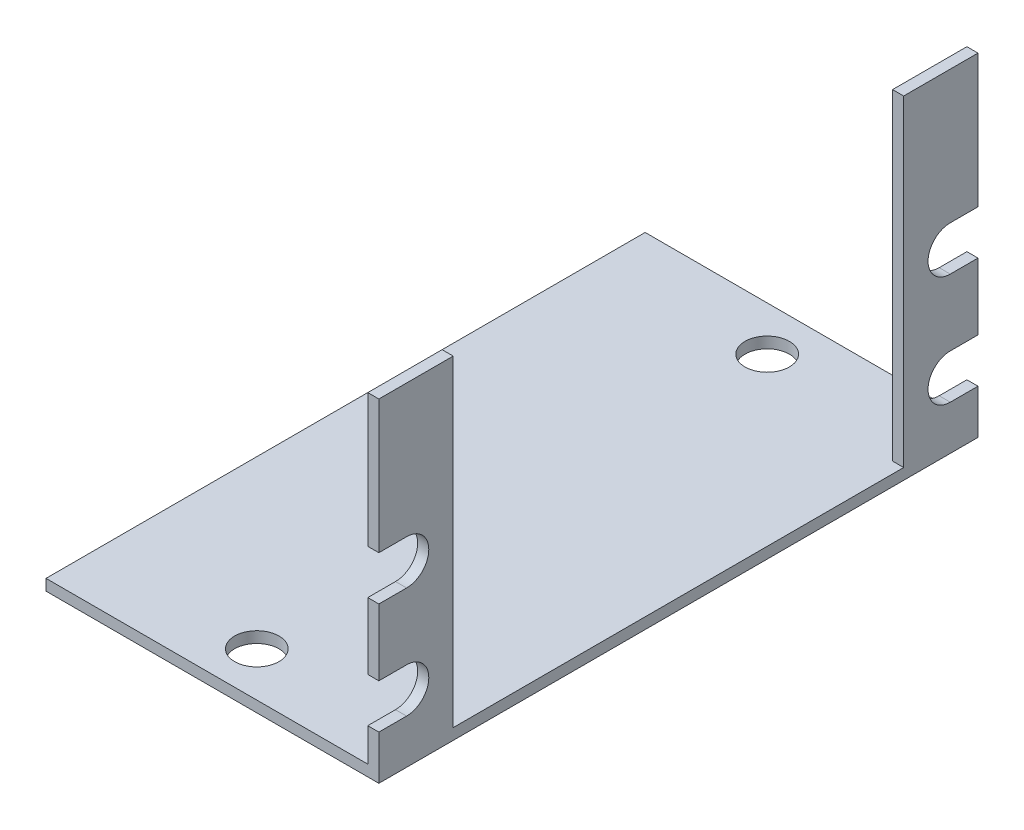
ISO-10303-21;
HEADER;
FILE_DESCRIPTION(('STEP AP214'),'2;1');
FILE_NAME('part.step','',(''),(''),'','','');
FILE_SCHEMA(('AUTOMOTIVE_DESIGN { 1 0 10303 214 1 1 1 1 }'));
ENDSEC;
DATA;
#1=APPLICATION_CONTEXT('core data for automotive mechanical design processes');
#2=APPLICATION_PROTOCOL_DEFINITION('international standard','automotive_design',2000,#1);
#3=PRODUCT_CONTEXT('',#1,'mechanical');
#4=PRODUCT('Part','Part','',(#3));
#5=PRODUCT_RELATED_PRODUCT_CATEGORY('part','',(#4));
#6=PRODUCT_DEFINITION_FORMATION('','',#4);
#7=PRODUCT_DEFINITION_CONTEXT('part definition',#1,'design');
#8=PRODUCT_DEFINITION('design','',#6,#7);
#9=PRODUCT_DEFINITION_SHAPE('','',#8);
#10=(LENGTH_UNIT() NAMED_UNIT(*) SI_UNIT(.MILLI.,.METRE.));
#11=(NAMED_UNIT(*) PLANE_ANGLE_UNIT() SI_UNIT($,.RADIAN.));
#12=(NAMED_UNIT(*) SI_UNIT($,.STERADIAN.) SOLID_ANGLE_UNIT());
#13=UNCERTAINTY_MEASURE_WITH_UNIT(LENGTH_MEASURE(1.E-05),#10,'distance_accuracy_value','');
#14=(GEOMETRIC_REPRESENTATION_CONTEXT(3) GLOBAL_UNCERTAINTY_ASSIGNED_CONTEXT((#13)) GLOBAL_UNIT_ASSIGNED_CONTEXT((#10,
#11,#12)) REPRESENTATION_CONTEXT('',''));
#15=CARTESIAN_POINT('',(0.,0.,0.));
#16=DIRECTION('',(0.,0.,1.));
#17=DIRECTION('',(1.,0.,0.));
#18=AXIS2_PLACEMENT_3D('',#15,#16,#17);
#19=CARTESIAN_POINT('',(-29.,0.,27.));
#20=DIRECTION('',(0.,0.,-1.));
#21=DIRECTION('',(-1.,0.,0.));
#22=AXIS2_PLACEMENT_3D('',#19,#20,#21);
#23=PLANE('',#22);
#24=DIRECTION('',(0.,-1.,0.));
#25=VECTOR('',#24,1.);
#26=CARTESIAN_POINT('',(0.,0.,27.));
#27=LINE('',#26,#25);
#28=CARTESIAN_POINT('',(0.,29.,27.));
#29=VERTEX_POINT('',#28);
#30=CARTESIAN_POINT('',(0.,17.,27.));
#31=VERTEX_POINT('',#30);
#32=EDGE_CURVE('E359',#29,#31,#27,.T.);
#33=ORIENTED_EDGE('',*,*,#32,.T.);
#34=DIRECTION('',(-1.,0.,0.));
#35=VECTOR('',#34,1.);
#36=CARTESIAN_POINT('',(0.999999999999997,17.,27.));
#37=LINE('',#36,#35);
#38=CARTESIAN_POINT('',(0.999999999999997,17.,27.));
#39=VERTEX_POINT('',#38);
#40=EDGE_CURVE('E240',#39,#31,#37,.T.);
#41=ORIENTED_EDGE('',*,*,#40,.F.);
#42=DIRECTION('',(0.,1.,0.));
#43=VECTOR('',#42,1.);
#44=CARTESIAN_POINT('',(0.999999999999994,29.,27.));
#45=LINE('',#44,#43);
#46=CARTESIAN_POINT('',(0.999999999999994,29.,27.));
#47=VERTEX_POINT('',#46);
#48=EDGE_CURVE('E351',#39,#47,#45,.T.);
#49=ORIENTED_EDGE('',*,*,#48,.T.);
#50=DIRECTION('',(-1.,0.,0.));
#51=VECTOR('',#50,1.);
#52=CARTESIAN_POINT('',(0.,29.,27.));
#53=LINE('',#52,#51);
#54=EDGE_CURVE('E355',#47,#29,#53,.T.);
#55=ORIENTED_EDGE('',*,*,#54,.T.);
#56=EDGE_LOOP('',(#33,#41,#49,#55));
#57=FACE_BOUND('',#56,.T.);
#58=ADVANCED_FACE('F32',(#57),#23,.F.);
#59=CARTESIAN_POINT('',(0.999999999999997,7.,27.));
#60=VERTEX_POINT('',#59);
#61=CARTESIAN_POINT('',(0.999999999999997,13.,27.));
#62=VERTEX_POINT('',#61);
#63=EDGE_CURVE('E356',#60,#62,#45,.T.);
#64=ORIENTED_EDGE('',*,*,#63,.T.);
#65=DIRECTION('',(-1.,0.,0.));
#66=VECTOR('',#65,1.);
#67=CARTESIAN_POINT('',(0.999999999999997,13.,27.));
#68=LINE('',#67,#66);
#69=CARTESIAN_POINT('',(0.,13.,27.));
#70=VERTEX_POINT('',#69);
#71=EDGE_CURVE('E211',#62,#70,#68,.T.);
#72=ORIENTED_EDGE('',*,*,#71,.T.);
#73=CARTESIAN_POINT('',(0.,7.,27.));
#74=VERTEX_POINT('',#73);
#75=EDGE_CURVE('E363',#70,#74,#27,.T.);
#76=ORIENTED_EDGE('',*,*,#75,.T.);
#77=DIRECTION('',(-1.,0.,0.));
#78=VECTOR('',#77,1.);
#79=CARTESIAN_POINT('',(0.999999999999997,7.,27.));
#80=LINE('',#79,#78);
#81=EDGE_CURVE('E262',#60,#74,#80,.T.);
#82=ORIENTED_EDGE('',*,*,#81,.F.);
#83=EDGE_LOOP('',(#64,#72,#76,#82));
#84=FACE_BOUND('',#83,.T.);
#85=ADVANCED_FACE('F466',(#84),#23,.F.);
#86=CARTESIAN_POINT('',(-29.,0.,-27.));
#87=DIRECTION('',(0.,0.,-1.));
#88=DIRECTION('',(-1.,0.,0.));
#89=AXIS2_PLACEMENT_3D('',#86,#87,#88);
#90=PLANE('',#89);
#91=DIRECTION('',(-1.,0.,0.));
#92=VECTOR('',#91,1.);
#93=CARTESIAN_POINT('',(0.999999999999997,13.,-27.));
#94=LINE('',#93,#92);
#95=CARTESIAN_POINT('',(0.999999999999997,13.,-27.));
#96=VERTEX_POINT('',#95);
#97=CARTESIAN_POINT('',(0.,13.,-27.));
#98=VERTEX_POINT('',#97);
#99=EDGE_CURVE('E288',#96,#98,#94,.T.);
#100=ORIENTED_EDGE('',*,*,#99,.F.);
#101=DIRECTION('',(0.,1.,0.));
#102=VECTOR('',#101,1.);
#103=CARTESIAN_POINT('',(0.999999999999994,29.,-27.));
#104=LINE('',#103,#102);
#105=CARTESIAN_POINT('',(0.999999999999997,7.,-27.));
#106=VERTEX_POINT('',#105);
#107=EDGE_CURVE('E375',#106,#96,#104,.T.);
#108=ORIENTED_EDGE('',*,*,#107,.F.);
#109=DIRECTION('',(-1.,0.,0.));
#110=VECTOR('',#109,1.);
#111=CARTESIAN_POINT('',(0.999999999999997,7.,-27.));
#112=LINE('',#111,#110);
#113=CARTESIAN_POINT('',(0.,7.,-27.));
#114=VERTEX_POINT('',#113);
#115=EDGE_CURVE('E317',#106,#114,#112,.T.);
#116=ORIENTED_EDGE('',*,*,#115,.T.);
#117=DIRECTION('',(0.,-1.,0.));
#118=VECTOR('',#117,1.);
#119=CARTESIAN_POINT('',(0.,0.,-27.));
#120=LINE('',#119,#118);
#121=EDGE_CURVE('E382',#98,#114,#120,.T.);
#122=ORIENTED_EDGE('',*,*,#121,.F.);
#123=EDGE_LOOP('',(#100,#108,#116,#122));
#124=FACE_BOUND('',#123,.T.);
#125=ADVANCED_FACE('F427',(#124),#90,.T.);
#126=DIRECTION('',(-1.,0.,0.));
#127=VECTOR('',#126,1.);
#128=CARTESIAN_POINT('',(0.999999999999997,3.,-27.));
#129=LINE('',#128,#127);
#130=CARTESIAN_POINT('',(0.999999999999997,3.,-27.));
#131=VERTEX_POINT('',#130);
#132=CARTESIAN_POINT('',(0.,3.,-27.));
#133=VERTEX_POINT('',#132);
#134=EDGE_CURVE('E315',#131,#133,#129,.T.);
#135=ORIENTED_EDGE('',*,*,#134,.F.);
#136=CARTESIAN_POINT('',(0.999999999999997,-0.999999999999996,-27.));
#137=VERTEX_POINT('',#136);
#138=EDGE_CURVE('E371',#137,#131,#104,.T.);
#139=ORIENTED_EDGE('',*,*,#138,.F.);
#140=DIRECTION('',(1.,0.,0.));
#141=VECTOR('',#140,1.);
#142=CARTESIAN_POINT('',(0.999999999999997,-0.999999999999996,-27.));
#143=LINE('',#142,#141);
#144=CARTESIAN_POINT('',(-29.,-1.,-27.));
#145=VERTEX_POINT('',#144);
#146=EDGE_CURVE('E368',#145,#137,#143,.T.);
#147=ORIENTED_EDGE('',*,*,#146,.F.);
#148=DIRECTION('',(0.,-1.,0.));
#149=VECTOR('',#148,1.);
#150=CARTESIAN_POINT('',(-29.,-1.,-27.));
#151=LINE('',#150,#149);
#152=CARTESIAN_POINT('',(-29.,0.,-27.));
#153=VERTEX_POINT('',#152);
#154=EDGE_CURVE('E344',#153,#145,#151,.T.);
#155=ORIENTED_EDGE('',*,*,#154,.F.);
#156=DIRECTION('',(-1.,0.,0.));
#157=VECTOR('',#156,1.);
#158=CARTESIAN_POINT('',(-29.,0.,-27.));
#159=LINE('',#158,#157);
#160=CARTESIAN_POINT('',(0.,0.,-27.));
#161=VERTEX_POINT('',#160);
#162=EDGE_CURVE('E349',#161,#153,#159,.T.);
#163=ORIENTED_EDGE('',*,*,#162,.F.);
#164=EDGE_CURVE('E378',#133,#161,#120,.T.);
#165=ORIENTED_EDGE('',*,*,#164,.F.);
#166=EDGE_LOOP('',(#135,#139,#147,#155,#163,#165));
#167=FACE_BOUND('',#166,.T.);
#168=ADVANCED_FACE('F404',(#167),#90,.T.);
#169=CARTESIAN_POINT('',(0.,29.,27.));
#170=DIRECTION('',(0.,-1.,0.));
#171=DIRECTION('',(0.,0.,-1.));
#172=AXIS2_PLACEMENT_3D('',#169,#170,#171);
#173=PLANE('',#172);
#174=DIRECTION('',(0.,0.,-1.));
#175=VECTOR('',#174,1.);
#176=CARTESIAN_POINT('',(0.,29.,27.));
#177=LINE('',#176,#175);
#178=CARTESIAN_POINT('',(0.,29.,-20.3));
#179=VERTEX_POINT('',#178);
#180=CARTESIAN_POINT('',(0.,29.,-27.));
#181=VERTEX_POINT('',#180);
#182=EDGE_CURVE('E390',#179,#181,#177,.T.);
#183=ORIENTED_EDGE('',*,*,#182,.F.);
#184=DIRECTION('',(1.,0.,0.));
#185=VECTOR('',#184,1.);
#186=CARTESIAN_POINT('',(0.,29.,-20.3));
#187=LINE('',#186,#185);
#188=CARTESIAN_POINT('',(0.999999999999997,29.,-20.3));
#189=VERTEX_POINT('',#188);
#190=EDGE_CURVE('E341',#179,#189,#187,.T.);
#191=ORIENTED_EDGE('',*,*,#190,.T.);
#192=DIRECTION('',(0.,0.,-1.));
#193=VECTOR('',#192,1.);
#194=CARTESIAN_POINT('',(0.999999999999994,29.,27.));
#195=LINE('',#194,#193);
#196=CARTESIAN_POINT('',(0.999999999999994,29.,-27.));
#197=VERTEX_POINT('',#196);
#198=EDGE_CURVE('E394',#189,#197,#195,.T.);
#199=ORIENTED_EDGE('',*,*,#198,.T.);
#200=DIRECTION('',(-1.,0.,0.));
#201=VECTOR('',#200,1.);
#202=CARTESIAN_POINT('',(0.,29.,-27.));
#203=LINE('',#202,#201);
#204=EDGE_CURVE('E374',#197,#181,#203,.T.);
#205=ORIENTED_EDGE('',*,*,#204,.T.);
#206=EDGE_LOOP('',(#183,#191,#199,#205));
#207=FACE_BOUND('',#206,.T.);
#208=ADVANCED_FACE('F437',(#207),#173,.F.);
#209=CARTESIAN_POINT('',(0.,0.,27.));
#210=DIRECTION('',(1.,0.,0.));
#211=DIRECTION('',(0.,0.,-1.));
#212=AXIS2_PLACEMENT_3D('',#209,#210,#211);
#213=PLANE('',#212);
#214=CARTESIAN_POINT('',(0.,15.,-24.5));
#215=DIRECTION('',(-1.,0.,0.));
#216=DIRECTION('',(0.,0.,1.));
#217=AXIS2_PLACEMENT_3D('',#214,#215,#216);
#218=CIRCLE('',#217,2.);
#219=CARTESIAN_POINT('',(0.,13.,-24.5));
#220=VERTEX_POINT('',#219);
#221=CARTESIAN_POINT('',(0.,17.,-24.5));
#222=VERTEX_POINT('',#221);
#223=EDGE_CURVE('E261',#220,#222,#218,.T.);
#224=ORIENTED_EDGE('',*,*,#223,.F.);
#225=DIRECTION('',(0.,0.,1.));
#226=VECTOR('',#225,1.);
#227=CARTESIAN_POINT('',(0.,13.,-24.5));
#228=LINE('',#227,#226);
#229=EDGE_CURVE('E272',#98,#220,#228,.T.);
#230=ORIENTED_EDGE('',*,*,#229,.F.);
#231=ORIENTED_EDGE('',*,*,#121,.T.);
#232=DIRECTION('',(0.,0.,-1.));
#233=VECTOR('',#232,1.);
#234=CARTESIAN_POINT('',(0.,7.,-24.5));
#235=LINE('',#234,#233);
#236=CARTESIAN_POINT('',(0.,7.,-24.5));
#237=VERTEX_POINT('',#236);
#238=EDGE_CURVE('E307',#237,#114,#235,.T.);
#239=ORIENTED_EDGE('',*,*,#238,.F.);
#240=CARTESIAN_POINT('',(0.,5.,-24.5));
#241=DIRECTION('',(-1.,0.,0.));
#242=DIRECTION('',(0.,0.,1.));
#243=AXIS2_PLACEMENT_3D('',#240,#241,#242);
#244=CIRCLE('',#243,2.);
#245=CARTESIAN_POINT('',(0.,3.,-24.5));
#246=VERTEX_POINT('',#245);
#247=EDGE_CURVE('E287',#246,#237,#244,.T.);
#248=ORIENTED_EDGE('',*,*,#247,.F.);
#249=DIRECTION('',(0.,0.,1.));
#250=VECTOR('',#249,1.);
#251=CARTESIAN_POINT('',(0.,3.,-24.5));
#252=LINE('',#251,#250);
#253=EDGE_CURVE('E298',#133,#246,#252,.T.);
#254=ORIENTED_EDGE('',*,*,#253,.F.);
#255=ORIENTED_EDGE('',*,*,#164,.T.);
#256=DIRECTION('',(0.,0.,-1.));
#257=VECTOR('',#256,1.);
#258=CARTESIAN_POINT('',(0.,0.,27.));
#259=LINE('',#258,#257);
#260=CARTESIAN_POINT('',(0.,0.,-20.3));
#261=VERTEX_POINT('',#260);
#262=EDGE_CURVE('E386',#261,#161,#259,.T.);
#263=ORIENTED_EDGE('',*,*,#262,.F.);
#264=DIRECTION('',(0.,-1.,0.));
#265=VECTOR('',#264,1.);
#266=CARTESIAN_POINT('',(0.,30.,-20.3));
#267=LINE('',#266,#265);
#268=EDGE_CURVE('E314',#179,#261,#267,.T.);
#269=ORIENTED_EDGE('',*,*,#268,.F.);
#270=ORIENTED_EDGE('',*,*,#182,.T.);
#271=CARTESIAN_POINT('',(0.,17.,-27.));
#272=VERTEX_POINT('',#271);
#273=EDGE_CURVE('E379',#181,#272,#120,.T.);
#274=ORIENTED_EDGE('',*,*,#273,.T.);
#275=DIRECTION('',(0.,0.,-1.));
#276=VECTOR('',#275,1.);
#277=CARTESIAN_POINT('',(0.,17.,-24.5));
#278=LINE('',#277,#276);
#279=EDGE_CURVE('E281',#222,#272,#278,.T.);
#280=ORIENTED_EDGE('',*,*,#279,.F.);
#281=EDGE_LOOP('',(#224,#230,#231,#239,#248,#254,#255,#263,#269,#270,#274,#280));
#282=FACE_BOUND('',#281,.T.);
#283=ADVANCED_FACE('F414',(#282),#213,.F.);
#284=CARTESIAN_POINT('',(-29.,-1.,27.));
#285=DIRECTION('',(1.,0.,0.));
#286=DIRECTION('',(0.,0.,-1.));
#287=AXIS2_PLACEMENT_3D('',#284,#285,#286);
#288=PLANE('',#287);
#289=ORIENTED_EDGE('',*,*,#154,.T.);
#290=DIRECTION('',(0.,0.,-1.));
#291=VECTOR('',#290,1.);
#292=CARTESIAN_POINT('',(-29.,-1.,27.));
#293=LINE('',#292,#291);
#294=CARTESIAN_POINT('',(-29.,-1.,27.));
#295=VERTEX_POINT('',#294);
#296=EDGE_CURVE('E11',#295,#145,#293,.T.);
#297=ORIENTED_EDGE('',*,*,#296,.F.);
#298=DIRECTION('',(0.,-1.,0.));
#299=VECTOR('',#298,1.);
#300=CARTESIAN_POINT('',(-29.,-1.,27.));
#301=LINE('',#300,#299);
#302=CARTESIAN_POINT('',(-29.,0.,27.));
#303=VERTEX_POINT('',#302);
#304=EDGE_CURVE('E345',#303,#295,#301,.T.);
#305=ORIENTED_EDGE('',*,*,#304,.F.);
#306=DIRECTION('',(0.,0.,-1.));
#307=VECTOR('',#306,1.);
#308=CARTESIAN_POINT('',(-29.,0.,27.));
#309=LINE('',#308,#307);
#310=EDGE_CURVE('E365',#303,#153,#309,.T.);
#311=ORIENTED_EDGE('',*,*,#310,.T.);
#312=EDGE_LOOP('',(#289,#297,#305,#311));
#313=FACE_BOUND('',#312,.T.);
#314=ADVANCED_FACE('F34',(#313),#288,.F.);
#315=CARTESIAN_POINT('',(0.999999999999997,-0.999999999999996,27.));
#316=DIRECTION('',(0.,1.,0.));
#317=DIRECTION('',(-1.,0.,0.));
#318=AXIS2_PLACEMENT_3D('',#315,#316,#317);
#319=PLANE('',#318);
#320=CARTESIAN_POINT('',(-14.,-1.,23.));
#321=DIRECTION('',(0.,1.,0.));
#322=DIRECTION('',(1.,0.,0.));
#323=AXIS2_PLACEMENT_3D('',#320,#321,#322);
#324=CIRCLE('',#323,2.);
#325=CARTESIAN_POINT('',(-12.,-1.,23.));
#326=VERTEX_POINT('',#325);
#327=EDGE_CURVE('E703',#326,#326,#324,.T.);
#328=ORIENTED_EDGE('',*,*,#327,.T.);
#329=EDGE_LOOP('',(#328));
#330=FACE_BOUND('',#329,.T.);
#331=CARTESIAN_POINT('',(-14.,-1.,-23.));
#332=DIRECTION('',(0.,1.,0.));
#333=DIRECTION('',(-1.,0.,0.));
#334=AXIS2_PLACEMENT_3D('',#331,#332,#333);
#335=CIRCLE('',#334,2.);
#336=CARTESIAN_POINT('',(-16.,-1.,-23.));
#337=VERTEX_POINT('',#336);
#338=EDGE_CURVE('E235',#337,#337,#335,.T.);
#339=ORIENTED_EDGE('',*,*,#338,.T.);
#340=EDGE_LOOP('',(#339));
#341=FACE_BOUND('',#340,.T.);
#342=ORIENTED_EDGE('',*,*,#146,.T.);
#343=DIRECTION('',(0.,0.,-1.));
#344=VECTOR('',#343,1.);
#345=CARTESIAN_POINT('',(0.999999999999997,-0.999999999999996,27.));
#346=LINE('',#345,#344);
#347=CARTESIAN_POINT('',(0.999999999999997,-0.999999999999996,27.));
#348=VERTEX_POINT('',#347);
#349=EDGE_CURVE('E40',#348,#137,#346,.T.);
#350=ORIENTED_EDGE('',*,*,#349,.F.);
#351=DIRECTION('',(1.,0.,0.));
#352=VECTOR('',#351,1.);
#353=CARTESIAN_POINT('',(0.999999999999997,-0.999999999999996,27.));
#354=LINE('',#353,#352);
#355=EDGE_CURVE('E348',#295,#348,#354,.T.);
#356=ORIENTED_EDGE('',*,*,#355,.F.);
#357=ORIENTED_EDGE('',*,*,#296,.T.);
#358=EDGE_LOOP('',(#342,#350,#356,#357));
#359=FACE_BOUND('',#358,.T.);
#360=ADVANCED_FACE('F482',(#330,#341,#359),#319,.F.);
#361=CARTESIAN_POINT('',(0.999999999999994,29.,27.));
#362=DIRECTION('',(-1.,0.,0.));
#363=DIRECTION('',(0.,-1.,0.));
#364=AXIS2_PLACEMENT_3D('',#361,#362,#363);
#365=PLANE('',#364);
#366=ORIENTED_EDGE('',*,*,#48,.F.);
#367=DIRECTION('',(0.,0.,-1.));
#368=VECTOR('',#367,1.);
#369=CARTESIAN_POINT('',(0.999999999999997,17.,24.5));
#370=LINE('',#369,#368);
#371=CARTESIAN_POINT('',(0.999999999999997,17.,24.5));
#372=VERTEX_POINT('',#371);
#373=EDGE_CURVE('E212',#39,#372,#370,.T.);
#374=ORIENTED_EDGE('',*,*,#373,.T.);
#375=CARTESIAN_POINT('',(0.999999999999997,15.,24.5));
#376=DIRECTION('',(-1.,0.,0.));
#377=DIRECTION('',(0.,0.,1.));
#378=AXIS2_PLACEMENT_3D('',#375,#376,#377);
#379=CIRCLE('',#378,2.);
#380=CARTESIAN_POINT('',(0.999999999999997,13.,24.5));
#381=VERTEX_POINT('',#380);
#382=EDGE_CURVE('E207',#372,#381,#379,.T.);
#383=ORIENTED_EDGE('',*,*,#382,.T.);
#384=DIRECTION('',(0.,0.,1.));
#385=VECTOR('',#384,1.);
#386=CARTESIAN_POINT('',(0.999999999999997,13.,24.5));
#387=LINE('',#386,#385);
#388=EDGE_CURVE('E215',#381,#62,#387,.T.);
#389=ORIENTED_EDGE('',*,*,#388,.T.);
#390=ORIENTED_EDGE('',*,*,#63,.F.);
#391=DIRECTION('',(0.,0.,-1.));
#392=VECTOR('',#391,1.);
#393=CARTESIAN_POINT('',(0.999999999999997,7.,24.5));
#394=LINE('',#393,#392);
#395=CARTESIAN_POINT('',(0.999999999999997,7.,24.5));
#396=VERTEX_POINT('',#395);
#397=EDGE_CURVE('E250',#60,#396,#394,.T.);
#398=ORIENTED_EDGE('',*,*,#397,.T.);
#399=CARTESIAN_POINT('',(0.999999999999997,5.,24.5));
#400=DIRECTION('',(-1.,0.,0.));
#401=DIRECTION('',(0.,0.,1.));
#402=AXIS2_PLACEMENT_3D('',#399,#400,#401);
#403=CIRCLE('',#402,2.);
#404=CARTESIAN_POINT('',(0.999999999999997,3.,24.5));
#405=VERTEX_POINT('',#404);
#406=EDGE_CURVE('E243',#396,#405,#403,.T.);
#407=ORIENTED_EDGE('',*,*,#406,.T.);
#408=DIRECTION('',(0.,0.,1.));
#409=VECTOR('',#408,1.);
#410=CARTESIAN_POINT('',(0.999999999999997,3.,24.5));
#411=LINE('',#410,#409);
#412=CARTESIAN_POINT('',(0.999999999999997,3.,27.));
#413=VERTEX_POINT('',#412);
#414=EDGE_CURVE('E246',#405,#413,#411,.T.);
#415=ORIENTED_EDGE('',*,*,#414,.T.);
#416=EDGE_CURVE('E352',#348,#413,#45,.T.);
#417=ORIENTED_EDGE('',*,*,#416,.F.);
#418=ORIENTED_EDGE('',*,*,#349,.T.);
#419=ORIENTED_EDGE('',*,*,#138,.T.);
#420=DIRECTION('',(0.,0.,1.));
#421=VECTOR('',#420,1.);
#422=CARTESIAN_POINT('',(0.999999999999997,3.,-24.5));
#423=LINE('',#422,#421);
#424=CARTESIAN_POINT('',(0.999999999999997,3.,-24.5));
#425=VERTEX_POINT('',#424);
#426=EDGE_CURVE('E301',#131,#425,#423,.T.);
#427=ORIENTED_EDGE('',*,*,#426,.T.);
#428=CARTESIAN_POINT('',(0.999999999999997,5.,-24.5));
#429=DIRECTION('',(-1.,0.,0.));
#430=DIRECTION('',(0.,0.,1.));
#431=AXIS2_PLACEMENT_3D('',#428,#429,#430);
#432=CIRCLE('',#431,2.);
#433=CARTESIAN_POINT('',(0.999999999999997,7.,-24.5));
#434=VERTEX_POINT('',#433);
#435=EDGE_CURVE('E294',#425,#434,#432,.T.);
#436=ORIENTED_EDGE('',*,*,#435,.T.);
#437=DIRECTION('',(0.,0.,-1.));
#438=VECTOR('',#437,1.);
#439=CARTESIAN_POINT('',(0.999999999999997,7.,-24.5));
#440=LINE('',#439,#438);
#441=EDGE_CURVE('E297',#434,#106,#440,.T.);
#442=ORIENTED_EDGE('',*,*,#441,.T.);
#443=ORIENTED_EDGE('',*,*,#107,.T.);
#444=DIRECTION('',(0.,0.,1.));
#445=VECTOR('',#444,1.);
#446=CARTESIAN_POINT('',(0.999999999999997,13.,-24.5));
#447=LINE('',#446,#445);
#448=CARTESIAN_POINT('',(0.999999999999997,13.,-24.5));
#449=VERTEX_POINT('',#448);
#450=EDGE_CURVE('E275',#96,#449,#447,.T.);
#451=ORIENTED_EDGE('',*,*,#450,.T.);
#452=CARTESIAN_POINT('',(0.999999999999997,15.,-24.5));
#453=DIRECTION('',(-1.,0.,0.));
#454=DIRECTION('',(0.,0.,1.));
#455=AXIS2_PLACEMENT_3D('',#452,#453,#454);
#456=CIRCLE('',#455,2.);
#457=CARTESIAN_POINT('',(0.999999999999997,17.,-24.5));
#458=VERTEX_POINT('',#457);
#459=EDGE_CURVE('E268',#449,#458,#456,.T.);
#460=ORIENTED_EDGE('',*,*,#459,.T.);
#461=DIRECTION('',(0.,0.,-1.));
#462=VECTOR('',#461,1.);
#463=CARTESIAN_POINT('',(0.999999999999997,17.,-24.5));
#464=LINE('',#463,#462);
#465=CARTESIAN_POINT('',(0.999999999999997,17.,-27.));
#466=VERTEX_POINT('',#465);
#467=EDGE_CURVE('E271',#458,#466,#464,.T.);
#468=ORIENTED_EDGE('',*,*,#467,.T.);
#469=EDGE_CURVE('E370',#466,#197,#104,.T.);
#470=ORIENTED_EDGE('',*,*,#469,.T.);
#471=ORIENTED_EDGE('',*,*,#198,.F.);
#472=DIRECTION('',(0.,-1.,0.));
#473=VECTOR('',#472,1.);
#474=CARTESIAN_POINT('',(0.999999999999997,30.,-20.3));
#475=LINE('',#474,#473);
#476=CARTESIAN_POINT('',(0.999999999999997,0.,-20.3));
#477=VERTEX_POINT('',#476);
#478=EDGE_CURVE('E321',#189,#477,#475,.T.);
#479=ORIENTED_EDGE('',*,*,#478,.T.);
#480=DIRECTION('',(0.,0.,1.));
#481=VECTOR('',#480,1.);
#482=CARTESIAN_POINT('',(0.999999999999997,0.,-20.3));
#483=LINE('',#482,#481);
#484=CARTESIAN_POINT('',(0.999999999999997,0.,20.3));
#485=VERTEX_POINT('',#484);
#486=EDGE_CURVE('E324',#477,#485,#483,.T.);
#487=ORIENTED_EDGE('',*,*,#486,.T.);
#488=DIRECTION('',(0.,1.,0.));
#489=VECTOR('',#488,1.);
#490=CARTESIAN_POINT('',(0.999999999999997,30.,20.3));
#491=LINE('',#490,#489);
#492=CARTESIAN_POINT('',(0.999999999999997,29.,20.3));
#493=VERTEX_POINT('',#492);
#494=EDGE_CURVE('E328',#485,#493,#491,.T.);
#495=ORIENTED_EDGE('',*,*,#494,.T.);
#496=EDGE_CURVE('E395',#47,#493,#195,.T.);
#497=ORIENTED_EDGE('',*,*,#496,.F.);
#498=EDGE_LOOP('',(#366,#374,#383,#389,#390,#398,#407,#415,#417,#418,#419,#427,#436,#442,#443,
#451,#460,#468,#470,#471,#479,#487,#495,#497));
#499=FACE_BOUND('',#498,.T.);
#500=ADVANCED_FACE('F223',(#499),#365,.F.);
#501=ORIENTED_EDGE('',*,*,#496,.T.);
#502=DIRECTION('',(-1.,0.,0.));
#503=VECTOR('',#502,1.);
#504=CARTESIAN_POINT('',(0.,29.,20.3));
#505=LINE('',#504,#503);
#506=CARTESIAN_POINT('',(0.,29.,20.3));
#507=VERTEX_POINT('',#506);
#508=EDGE_CURVE('E337',#493,#507,#505,.T.);
#509=ORIENTED_EDGE('',*,*,#508,.T.);
#510=EDGE_CURVE('E391',#29,#507,#177,.T.);
#511=ORIENTED_EDGE('',*,*,#510,.F.);
#512=ORIENTED_EDGE('',*,*,#54,.F.);
#513=EDGE_LOOP('',(#501,#509,#511,#512));
#514=FACE_BOUND('',#513,.T.);
#515=ADVANCED_FACE('F456',(#514),#173,.F.);
#516=CARTESIAN_POINT('',(0.,15.,24.5));
#517=DIRECTION('',(-1.,0.,0.));
#518=DIRECTION('',(0.,0.,1.));
#519=AXIS2_PLACEMENT_3D('',#516,#517,#518);
#520=CIRCLE('',#519,2.);
#521=CARTESIAN_POINT('',(0.,17.,24.5));
#522=VERTEX_POINT('',#521);
#523=CARTESIAN_POINT('',(0.,13.,24.5));
#524=VERTEX_POINT('',#523);
#525=EDGE_CURVE('E47',#522,#524,#520,.T.);
#526=ORIENTED_EDGE('',*,*,#525,.F.);
#527=DIRECTION('',(0.,0.,-1.));
#528=VECTOR('',#527,1.);
#529=CARTESIAN_POINT('',(0.,17.,24.5));
#530=LINE('',#529,#528);
#531=EDGE_CURVE('E224',#31,#522,#530,.T.);
#532=ORIENTED_EDGE('',*,*,#531,.F.);
#533=ORIENTED_EDGE('',*,*,#32,.F.);
#534=ORIENTED_EDGE('',*,*,#510,.T.);
#535=DIRECTION('',(0.,1.,0.));
#536=VECTOR('',#535,1.);
#537=CARTESIAN_POINT('',(0.,30.,20.3));
#538=LINE('',#537,#536);
#539=CARTESIAN_POINT('',(0.,0.,20.3));
#540=VERTEX_POINT('',#539);
#541=EDGE_CURVE('E325',#540,#507,#538,.T.);
#542=ORIENTED_EDGE('',*,*,#541,.F.);
#543=CARTESIAN_POINT('',(0.,0.,27.));
#544=VERTEX_POINT('',#543);
#545=EDGE_CURVE('E387',#544,#540,#259,.T.);
#546=ORIENTED_EDGE('',*,*,#545,.F.);
#547=CARTESIAN_POINT('',(0.,3.,27.));
#548=VERTEX_POINT('',#547);
#549=EDGE_CURVE('E358',#548,#544,#27,.T.);
#550=ORIENTED_EDGE('',*,*,#549,.F.);
#551=DIRECTION('',(0.,0.,1.));
#552=VECTOR('',#551,1.);
#553=CARTESIAN_POINT('',(0.,3.,24.5));
#554=LINE('',#553,#552);
#555=CARTESIAN_POINT('',(0.,3.,24.5));
#556=VERTEX_POINT('',#555);
#557=EDGE_CURVE('E55',#556,#548,#554,.T.);
#558=ORIENTED_EDGE('',*,*,#557,.F.);
#559=CARTESIAN_POINT('',(0.,5.,24.5));
#560=DIRECTION('',(-1.,0.,0.));
#561=DIRECTION('',(0.,0.,1.));
#562=AXIS2_PLACEMENT_3D('',#559,#560,#561);
#563=CIRCLE('',#562,2.);
#564=CARTESIAN_POINT('',(0.,7.,24.5));
#565=VERTEX_POINT('',#564);
#566=EDGE_CURVE('E239',#565,#556,#563,.T.);
#567=ORIENTED_EDGE('',*,*,#566,.F.);
#568=DIRECTION('',(0.,0.,-1.));
#569=VECTOR('',#568,1.);
#570=CARTESIAN_POINT('',(0.,7.,24.5));
#571=LINE('',#570,#569);
#572=EDGE_CURVE('E247',#74,#565,#571,.T.);
#573=ORIENTED_EDGE('',*,*,#572,.F.);
#574=ORIENTED_EDGE('',*,*,#75,.F.);
#575=DIRECTION('',(0.,0.,1.));
#576=VECTOR('',#575,1.);
#577=CARTESIAN_POINT('',(0.,13.,24.5));
#578=LINE('',#577,#576);
#579=EDGE_CURVE('E227',#524,#70,#578,.T.);
#580=ORIENTED_EDGE('',*,*,#579,.F.);
#581=EDGE_LOOP('',(#526,#532,#533,#534,#542,#546,#550,#558,#567,#573,#574,#580));
#582=FACE_BOUND('',#581,.T.);
#583=ADVANCED_FACE('F460',(#582),#213,.F.);
#584=CARTESIAN_POINT('',(-29.,0.,27.));
#585=DIRECTION('',(0.,-1.,0.));
#586=DIRECTION('',(1.,0.,0.));
#587=AXIS2_PLACEMENT_3D('',#584,#585,#586);
#588=PLANE('',#587);
#589=CARTESIAN_POINT('',(-14.,0.,23.));
#590=DIRECTION('',(0.,1.,0.));
#591=DIRECTION('',(-1.,0.,0.));
#592=AXIS2_PLACEMENT_3D('',#589,#590,#591);
#593=CIRCLE('',#592,2.);
#594=CARTESIAN_POINT('',(-16.,0.,23.));
#595=VERTEX_POINT('',#594);
#596=EDGE_CURVE('E700',#595,#595,#593,.T.);
#597=ORIENTED_EDGE('',*,*,#596,.F.);
#598=EDGE_LOOP('',(#597));
#599=FACE_BOUND('',#598,.T.);
#600=CARTESIAN_POINT('',(-14.,0.,-23.));
#601=DIRECTION('',(0.,1.,0.));
#602=DIRECTION('',(-1.,0.,0.));
#603=AXIS2_PLACEMENT_3D('',#600,#601,#602);
#604=CIRCLE('',#603,2.);
#605=CARTESIAN_POINT('',(-16.,0.,-23.));
#606=VERTEX_POINT('',#605);
#607=EDGE_CURVE('E230',#606,#606,#604,.T.);
#608=ORIENTED_EDGE('',*,*,#607,.F.);
#609=EDGE_LOOP('',(#608));
#610=FACE_BOUND('',#609,.T.);
#611=ORIENTED_EDGE('',*,*,#162,.T.);
#612=ORIENTED_EDGE('',*,*,#310,.F.);
#613=DIRECTION('',(-1.,0.,0.));
#614=VECTOR('',#613,1.);
#615=CARTESIAN_POINT('',(-29.,0.,27.));
#616=LINE('',#615,#614);
#617=EDGE_CURVE('E362',#544,#303,#616,.T.);
#618=ORIENTED_EDGE('',*,*,#617,.F.);
#619=ORIENTED_EDGE('',*,*,#545,.T.);
#620=DIRECTION('',(-1.,0.,0.));
#621=VECTOR('',#620,1.);
#622=CARTESIAN_POINT('',(0.999999999999997,0.,20.3));
#623=LINE('',#622,#621);
#624=EDGE_CURVE('E335',#485,#540,#623,.T.);
#625=ORIENTED_EDGE('',*,*,#624,.F.);
#626=ORIENTED_EDGE('',*,*,#486,.F.);
#627=DIRECTION('',(-1.,0.,0.));
#628=VECTOR('',#627,1.);
#629=CARTESIAN_POINT('',(0.999999999999997,0.,-20.3));
#630=LINE('',#629,#628);
#631=EDGE_CURVE('E331',#477,#261,#630,.T.);
#632=ORIENTED_EDGE('',*,*,#631,.T.);
#633=ORIENTED_EDGE('',*,*,#262,.T.);
#634=EDGE_LOOP('',(#611,#612,#618,#619,#625,#626,#632,#633));
#635=FACE_BOUND('',#634,.T.);
#636=ADVANCED_FACE('F448',(#599,#610,#635),#588,.F.);
#637=ORIENTED_EDGE('',*,*,#416,.T.);
#638=DIRECTION('',(-1.,0.,0.));
#639=VECTOR('',#638,1.);
#640=CARTESIAN_POINT('',(0.999999999999997,3.,27.));
#641=LINE('',#640,#639);
#642=EDGE_CURVE('E265',#413,#548,#641,.T.);
#643=ORIENTED_EDGE('',*,*,#642,.T.);
#644=ORIENTED_EDGE('',*,*,#549,.T.);
#645=ORIENTED_EDGE('',*,*,#617,.T.);
#646=ORIENTED_EDGE('',*,*,#304,.T.);
#647=ORIENTED_EDGE('',*,*,#355,.T.);
#648=EDGE_LOOP('',(#637,#643,#644,#645,#646,#647));
#649=FACE_BOUND('',#648,.T.);
#650=ADVANCED_FACE('F478',(#649),#23,.F.);
#651=DIRECTION('',(-1.,0.,0.));
#652=VECTOR('',#651,1.);
#653=CARTESIAN_POINT('',(0.999999999999997,17.,-27.));
#654=LINE('',#653,#652);
#655=EDGE_CURVE('E290',#466,#272,#654,.T.);
#656=ORIENTED_EDGE('',*,*,#655,.T.);
#657=ORIENTED_EDGE('',*,*,#273,.F.);
#658=ORIENTED_EDGE('',*,*,#204,.F.);
#659=ORIENTED_EDGE('',*,*,#469,.F.);
#660=EDGE_LOOP('',(#656,#657,#658,#659));
#661=FACE_BOUND('',#660,.T.);
#662=ADVANCED_FACE('F439',(#661),#90,.T.);
#663=CARTESIAN_POINT('',(0.999999999999997,30.,-20.3));
#664=DIRECTION('',(0.,0.,-1.));
#665=DIRECTION('',(-1.,0.,0.));
#666=AXIS2_PLACEMENT_3D('',#663,#664,#665);
#667=PLANE('',#666);
#668=ORIENTED_EDGE('',*,*,#268,.T.);
#669=ORIENTED_EDGE('',*,*,#631,.F.);
#670=ORIENTED_EDGE('',*,*,#478,.F.);
#671=ORIENTED_EDGE('',*,*,#190,.F.);
#672=EDGE_LOOP('',(#668,#669,#670,#671));
#673=FACE_BOUND('',#672,.T.);
#674=ADVANCED_FACE('F443',(#673),#667,.F.);
#675=CARTESIAN_POINT('',(0.999999999999997,30.,20.3));
#676=DIRECTION('',(0.,0.,1.));
#677=DIRECTION('',(1.,0.,0.));
#678=AXIS2_PLACEMENT_3D('',#675,#676,#677);
#679=PLANE('',#678);
#680=ORIENTED_EDGE('',*,*,#494,.F.);
#681=ORIENTED_EDGE('',*,*,#624,.T.);
#682=ORIENTED_EDGE('',*,*,#541,.T.);
#683=ORIENTED_EDGE('',*,*,#508,.F.);
#684=EDGE_LOOP('',(#680,#681,#682,#683));
#685=FACE_BOUND('',#684,.T.);
#686=ADVANCED_FACE('F453',(#685),#679,.F.);
#687=CARTESIAN_POINT('',(0.999999999999997,5.,-24.5));
#688=DIRECTION('',(-1.,0.,0.));
#689=DIRECTION('',(0.,0.,1.));
#690=AXIS2_PLACEMENT_3D('',#687,#688,#689);
#691=CYLINDRICAL_SURFACE('',#690,2.);
#692=ORIENTED_EDGE('',*,*,#247,.T.);
#693=DIRECTION('',(-1.,0.,0.));
#694=VECTOR('',#693,1.);
#695=CARTESIAN_POINT('',(0.999999999999997,7.,-24.5));
#696=LINE('',#695,#694);
#697=EDGE_CURVE('E304',#434,#237,#696,.T.);
#698=ORIENTED_EDGE('',*,*,#697,.F.);
#699=ORIENTED_EDGE('',*,*,#435,.F.);
#700=DIRECTION('',(-1.,0.,0.));
#701=VECTOR('',#700,1.);
#702=CARTESIAN_POINT('',(0.999999999999997,3.,-24.5));
#703=LINE('',#702,#701);
#704=EDGE_CURVE('E312',#425,#246,#703,.T.);
#705=ORIENTED_EDGE('',*,*,#704,.T.);
#706=EDGE_LOOP('',(#692,#698,#699,#705));
#707=FACE_BOUND('',#706,.T.);
#708=ADVANCED_FACE('F419',(#707),#691,.F.);
#709=CARTESIAN_POINT('',(0.999999999999997,3.,-24.5));
#710=DIRECTION('',(0.,-1.,0.));
#711=DIRECTION('',(0.,0.,-1.));
#712=AXIS2_PLACEMENT_3D('',#709,#710,#711);
#713=PLANE('',#712);
#714=ORIENTED_EDGE('',*,*,#253,.T.);
#715=ORIENTED_EDGE('',*,*,#704,.F.);
#716=ORIENTED_EDGE('',*,*,#426,.F.);
#717=ORIENTED_EDGE('',*,*,#134,.T.);
#718=EDGE_LOOP('',(#714,#715,#716,#717));
#719=FACE_BOUND('',#718,.T.);
#720=ADVANCED_FACE('F410',(#719),#713,.F.);
#721=CARTESIAN_POINT('',(0.999999999999997,7.,-24.5));
#722=DIRECTION('',(0.,1.,0.));
#723=DIRECTION('',(0.,0.,1.));
#724=AXIS2_PLACEMENT_3D('',#721,#722,#723);
#725=PLANE('',#724);
#726=ORIENTED_EDGE('',*,*,#238,.T.);
#727=ORIENTED_EDGE('',*,*,#115,.F.);
#728=ORIENTED_EDGE('',*,*,#441,.F.);
#729=ORIENTED_EDGE('',*,*,#697,.T.);
#730=EDGE_LOOP('',(#726,#727,#728,#729));
#731=FACE_BOUND('',#730,.T.);
#732=ADVANCED_FACE('F573',(#731),#725,.F.);
#733=CARTESIAN_POINT('',(0.999999999999997,15.,-24.5));
#734=DIRECTION('',(-1.,0.,0.));
#735=DIRECTION('',(0.,0.,1.));
#736=AXIS2_PLACEMENT_3D('',#733,#734,#735);
#737=CYLINDRICAL_SURFACE('',#736,2.);
#738=ORIENTED_EDGE('',*,*,#223,.T.);
#739=DIRECTION('',(-1.,0.,0.));
#740=VECTOR('',#739,1.);
#741=CARTESIAN_POINT('',(0.999999999999997,17.,-24.5));
#742=LINE('',#741,#740);
#743=EDGE_CURVE('E278',#458,#222,#742,.T.);
#744=ORIENTED_EDGE('',*,*,#743,.F.);
#745=ORIENTED_EDGE('',*,*,#459,.F.);
#746=DIRECTION('',(-1.,0.,0.));
#747=VECTOR('',#746,1.);
#748=CARTESIAN_POINT('',(0.999999999999997,13.,-24.5));
#749=LINE('',#748,#747);
#750=EDGE_CURVE('E285',#449,#220,#749,.T.);
#751=ORIENTED_EDGE('',*,*,#750,.T.);
#752=EDGE_LOOP('',(#738,#744,#745,#751));
#753=FACE_BOUND('',#752,.T.);
#754=ADVANCED_FACE('F582',(#753),#737,.F.);
#755=CARTESIAN_POINT('',(0.999999999999997,13.,-24.5));
#756=DIRECTION('',(0.,-1.,0.));
#757=DIRECTION('',(0.,0.,-1.));
#758=AXIS2_PLACEMENT_3D('',#755,#756,#757);
#759=PLANE('',#758);
#760=ORIENTED_EDGE('',*,*,#229,.T.);
#761=ORIENTED_EDGE('',*,*,#750,.F.);
#762=ORIENTED_EDGE('',*,*,#450,.F.);
#763=ORIENTED_EDGE('',*,*,#99,.T.);
#764=EDGE_LOOP('',(#760,#761,#762,#763));
#765=FACE_BOUND('',#764,.T.);
#766=ADVANCED_FACE('F591',(#765),#759,.F.);
#767=CARTESIAN_POINT('',(0.999999999999997,17.,-24.5));
#768=DIRECTION('',(0.,1.,0.));
#769=DIRECTION('',(0.,0.,1.));
#770=AXIS2_PLACEMENT_3D('',#767,#768,#769);
#771=PLANE('',#770);
#772=ORIENTED_EDGE('',*,*,#279,.T.);
#773=ORIENTED_EDGE('',*,*,#655,.F.);
#774=ORIENTED_EDGE('',*,*,#467,.F.);
#775=ORIENTED_EDGE('',*,*,#743,.T.);
#776=EDGE_LOOP('',(#772,#773,#774,#775));
#777=FACE_BOUND('',#776,.T.);
#778=ADVANCED_FACE('F601',(#777),#771,.F.);
#779=CARTESIAN_POINT('',(0.999999999999997,5.,24.5));
#780=DIRECTION('',(-1.,0.,0.));
#781=DIRECTION('',(0.,0.,1.));
#782=AXIS2_PLACEMENT_3D('',#779,#780,#781);
#783=CYLINDRICAL_SURFACE('',#782,2.);
#784=ORIENTED_EDGE('',*,*,#566,.T.);
#785=DIRECTION('',(-1.,0.,0.));
#786=VECTOR('',#785,1.);
#787=CARTESIAN_POINT('',(0.999999999999997,3.,24.5));
#788=LINE('',#787,#786);
#789=EDGE_CURVE('E253',#405,#556,#788,.T.);
#790=ORIENTED_EDGE('',*,*,#789,.F.);
#791=ORIENTED_EDGE('',*,*,#406,.F.);
#792=DIRECTION('',(-1.,0.,0.));
#793=VECTOR('',#792,1.);
#794=CARTESIAN_POINT('',(0.999999999999997,7.,24.5));
#795=LINE('',#794,#793);
#796=EDGE_CURVE('E259',#396,#565,#795,.T.);
#797=ORIENTED_EDGE('',*,*,#796,.T.);
#798=EDGE_LOOP('',(#784,#790,#791,#797));
#799=FACE_BOUND('',#798,.T.);
#800=ADVANCED_FACE('F474',(#799),#783,.F.);
#801=CARTESIAN_POINT('',(0.999999999999997,7.,24.5));
#802=DIRECTION('',(0.,1.,0.));
#803=DIRECTION('',(0.,0.,1.));
#804=AXIS2_PLACEMENT_3D('',#801,#802,#803);
#805=PLANE('',#804);
#806=ORIENTED_EDGE('',*,*,#572,.T.);
#807=ORIENTED_EDGE('',*,*,#796,.F.);
#808=ORIENTED_EDGE('',*,*,#397,.F.);
#809=ORIENTED_EDGE('',*,*,#81,.T.);
#810=EDGE_LOOP('',(#806,#807,#808,#809));
#811=FACE_BOUND('',#810,.T.);
#812=ADVANCED_FACE('F470',(#811),#805,.F.);
#813=CARTESIAN_POINT('',(0.999999999999997,3.,24.5));
#814=DIRECTION('',(0.,-1.,0.));
#815=DIRECTION('',(0.,0.,-1.));
#816=AXIS2_PLACEMENT_3D('',#813,#814,#815);
#817=PLANE('',#816);
#818=ORIENTED_EDGE('',*,*,#557,.T.);
#819=ORIENTED_EDGE('',*,*,#642,.F.);
#820=ORIENTED_EDGE('',*,*,#414,.F.);
#821=ORIENTED_EDGE('',*,*,#789,.T.);
#822=EDGE_LOOP('',(#818,#819,#820,#821));
#823=FACE_BOUND('',#822,.T.);
#824=ADVANCED_FACE('F476',(#823),#817,.F.);
#825=CARTESIAN_POINT('',(0.999999999999997,15.,24.5));
#826=DIRECTION('',(-1.,0.,0.));
#827=DIRECTION('',(0.,0.,1.));
#828=AXIS2_PLACEMENT_3D('',#825,#826,#827);
#829=CYLINDRICAL_SURFACE('',#828,2.);
#830=ORIENTED_EDGE('',*,*,#525,.T.);
#831=DIRECTION('',(-1.,0.,0.));
#832=VECTOR('',#831,1.);
#833=CARTESIAN_POINT('',(0.999999999999997,13.,24.5));
#834=LINE('',#833,#832);
#835=EDGE_CURVE('E203',#381,#524,#834,.T.);
#836=ORIENTED_EDGE('',*,*,#835,.F.);
#837=ORIENTED_EDGE('',*,*,#382,.F.);
#838=DIRECTION('',(-1.,0.,0.));
#839=VECTOR('',#838,1.);
#840=CARTESIAN_POINT('',(0.999999999999997,17.,24.5));
#841=LINE('',#840,#839);
#842=EDGE_CURVE('E237',#372,#522,#841,.T.);
#843=ORIENTED_EDGE('',*,*,#842,.T.);
#844=EDGE_LOOP('',(#830,#836,#837,#843));
#845=FACE_BOUND('',#844,.T.);
#846=ADVANCED_FACE('F205',(#845),#829,.F.);
#847=CARTESIAN_POINT('',(0.999999999999997,17.,24.5));
#848=DIRECTION('',(0.,1.,0.));
#849=DIRECTION('',(0.,0.,1.));
#850=AXIS2_PLACEMENT_3D('',#847,#848,#849);
#851=PLANE('',#850);
#852=ORIENTED_EDGE('',*,*,#531,.T.);
#853=ORIENTED_EDGE('',*,*,#842,.F.);
#854=ORIENTED_EDGE('',*,*,#373,.F.);
#855=ORIENTED_EDGE('',*,*,#40,.T.);
#856=EDGE_LOOP('',(#852,#853,#854,#855));
#857=FACE_BOUND('',#856,.T.);
#858=ADVANCED_FACE('F644',(#857),#851,.F.);
#859=CARTESIAN_POINT('',(0.999999999999997,13.,24.5));
#860=DIRECTION('',(0.,-1.,0.));
#861=DIRECTION('',(0.,0.,-1.));
#862=AXIS2_PLACEMENT_3D('',#859,#860,#861);
#863=PLANE('',#862);
#864=ORIENTED_EDGE('',*,*,#579,.T.);
#865=ORIENTED_EDGE('',*,*,#71,.F.);
#866=ORIENTED_EDGE('',*,*,#388,.F.);
#867=ORIENTED_EDGE('',*,*,#835,.T.);
#868=EDGE_LOOP('',(#864,#865,#866,#867));
#869=FACE_BOUND('',#868,.T.);
#870=ADVANCED_FACE('F216',(#869),#863,.F.);
#871=CARTESIAN_POINT('',(-14.,-1.,-23.));
#872=DIRECTION('',(0.,1.,0.));
#873=DIRECTION('',(-1.,0.,0.));
#874=AXIS2_PLACEMENT_3D('',#871,#872,#873);
#875=CYLINDRICAL_SURFACE('',#874,2.);
#876=ORIENTED_EDGE('',*,*,#607,.T.);
#877=EDGE_LOOP('',(#876));
#878=FACE_BOUND('',#877,.T.);
#879=ORIENTED_EDGE('',*,*,#338,.F.);
#880=EDGE_LOOP('',(#879));
#881=FACE_BOUND('',#880,.T.);
#882=ADVANCED_FACE('F661',(#878,#881),#875,.F.);
#883=CARTESIAN_POINT('',(-14.,-1.,23.));
#884=DIRECTION('',(0.,1.,0.));
#885=DIRECTION('',(-1.,0.,0.));
#886=AXIS2_PLACEMENT_3D('',#883,#884,#885);
#887=CYLINDRICAL_SURFACE('',#886,2.);
#888=ORIENTED_EDGE('',*,*,#596,.T.);
#889=EDGE_LOOP('',(#888));
#890=FACE_BOUND('',#889,.T.);
#891=ORIENTED_EDGE('',*,*,#327,.F.);
#892=EDGE_LOOP('',(#891));
#893=FACE_BOUND('',#892,.T.);
#894=ADVANCED_FACE('F681',(#890,#893),#887,.F.);
#895=CLOSED_SHELL('',(#58,#85,#125,#168,#208,#283,#314,#360,#500,#515,#583,#636,#650,#662,#674,
#686,#708,#720,#732,#754,#766,#778,#800,#812,#824,#846,#858,#870,#882,#894));
#896=MANIFOLD_SOLID_BREP('B2',#895);
#897=ADVANCED_BREP_SHAPE_REPRESENTATION('',(#18,#896),#14);
#898=SHAPE_DEFINITION_REPRESENTATION(#9,#897);
ENDSEC;
END-ISO-10303-21;
